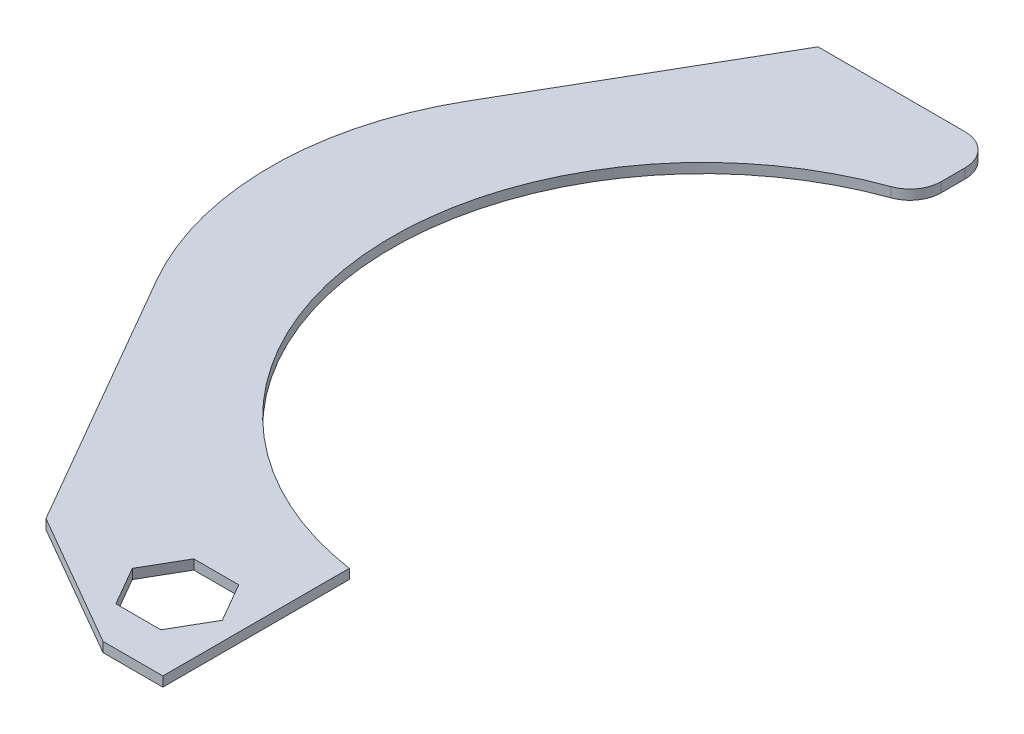
ISO-10303-21;
HEADER;
FILE_DESCRIPTION(('STEP AP214'),'2;1');
FILE_NAME('part.step','',(''),(''),'','','');
FILE_SCHEMA(('AUTOMOTIVE_DESIGN { 1 0 10303 214 1 1 1 1 }'));
ENDSEC;
DATA;
#1=APPLICATION_CONTEXT('core data for automotive mechanical design processes');
#2=APPLICATION_PROTOCOL_DEFINITION('international standard','automotive_design',2000,#1);
#3=PRODUCT_CONTEXT('',#1,'mechanical');
#4=PRODUCT('Part','Part','',(#3));
#5=PRODUCT_RELATED_PRODUCT_CATEGORY('part','',(#4));
#6=PRODUCT_DEFINITION_FORMATION('','',#4);
#7=PRODUCT_DEFINITION_CONTEXT('part definition',#1,'design');
#8=PRODUCT_DEFINITION('design','',#6,#7);
#9=PRODUCT_DEFINITION_SHAPE('','',#8);
#10=(LENGTH_UNIT() NAMED_UNIT(*) SI_UNIT(.MILLI.,.METRE.));
#11=(NAMED_UNIT(*) PLANE_ANGLE_UNIT() SI_UNIT($,.RADIAN.));
#12=(NAMED_UNIT(*) SI_UNIT($,.STERADIAN.) SOLID_ANGLE_UNIT());
#13=UNCERTAINTY_MEASURE_WITH_UNIT(LENGTH_MEASURE(1.E-05),#10,'distance_accuracy_value','');
#14=(GEOMETRIC_REPRESENTATION_CONTEXT(3) GLOBAL_UNCERTAINTY_ASSIGNED_CONTEXT((#13)) GLOBAL_UNIT_ASSIGNED_CONTEXT((#10,
#11,#12)) REPRESENTATION_CONTEXT('',''));
#15=CARTESIAN_POINT('',(0.,0.,0.));
#16=DIRECTION('',(0.,0.,1.));
#17=DIRECTION('',(1.,0.,0.));
#18=AXIS2_PLACEMENT_3D('',#15,#16,#17);
#19=CARTESIAN_POINT('',(-42.8876578754742,1.5875,-61.5836024579529));
#20=DIRECTION('',(0.866025403784439,0.,0.5));
#21=DIRECTION('',(0.5,0.,-0.866025403784439));
#22=AXIS2_PLACEMENT_3D('',#19,#20,#21);
#23=PLANE('',#22);
#24=DIRECTION('',(-0.5,0.,0.866025403784439));
#25=VECTOR('',#24,1.);
#26=CARTESIAN_POINT('',(-42.8876578754742,0.,-61.5836024579529));
#27=LINE('',#26,#25);
#28=CARTESIAN_POINT('',(-42.8876578754742,0.,-61.5836024579529));
#29=VERTEX_POINT('',#28);
#30=CARTESIAN_POINT('',(-63.7782704948237,0.,-25.4));
#31=VERTEX_POINT('',#30);
#32=EDGE_CURVE('E212',#29,#31,#27,.T.);
#33=ORIENTED_EDGE('',*,*,#32,.T.);
#34=DIRECTION('',(0.,-1.,0.));
#35=VECTOR('',#34,1.);
#36=CARTESIAN_POINT('',(-63.7782704948237,1.5875,-25.4));
#37=LINE('',#36,#35);
#38=CARTESIAN_POINT('',(-63.7782704948237,1.5875,-25.4));
#39=VERTEX_POINT('',#38);
#40=EDGE_CURVE('E50',#31,#39,#37,.F.);
#41=ORIENTED_EDGE('',*,*,#40,.T.);
#42=DIRECTION('',(-0.5,0.,0.866025403784439));
#43=VECTOR('',#42,1.);
#44=CARTESIAN_POINT('',(-42.8876578754742,1.5875,-61.5836024579529));
#45=LINE('',#44,#43);
#46=CARTESIAN_POINT('',(-42.8876578754742,1.5875,-61.5836024579529));
#47=VERTEX_POINT('',#46);
#48=EDGE_CURVE('E220',#47,#39,#45,.T.);
#49=ORIENTED_EDGE('',*,*,#48,.F.);
#50=DIRECTION('',(0.,-1.,0.));
#51=VECTOR('',#50,1.);
#52=CARTESIAN_POINT('',(-42.8876578754742,1.5875,-61.5836024579529));
#53=LINE('',#52,#51);
#54=EDGE_CURVE('E237',#47,#29,#53,.T.);
#55=ORIENTED_EDGE('',*,*,#54,.T.);
#56=EDGE_LOOP('',(#33,#41,#49,#55));
#57=FACE_BOUND('',#56,.T.);
#58=ADVANCED_FACE('F42',(#57),#23,.F.);
#59=CARTESIAN_POINT('',(-78.4429673322402,1.5875,0.));
#60=DIRECTION('',(0.866025403784439,0.,-0.5));
#61=DIRECTION('',(-0.5,0.,-0.866025403784439));
#62=AXIS2_PLACEMENT_3D('',#59,#60,#61);
#63=PLANE('',#62);
#64=DIRECTION('',(0.5,0.,0.866025403784439));
#65=VECTOR('',#64,1.);
#66=CARTESIAN_POINT('',(-78.4429673322402,1.5875,0.));
#67=LINE('',#66,#65);
#68=CARTESIAN_POINT('',(-63.7782704948237,1.5875,25.4));
#69=VERTEX_POINT('',#68);
#70=CARTESIAN_POINT('',(-39.2214836661201,1.5875,67.9336024579529));
#71=VERTEX_POINT('',#70);
#72=EDGE_CURVE('E222',#69,#71,#67,.T.);
#73=ORIENTED_EDGE('',*,*,#72,.F.);
#74=DIRECTION('',(0.,-1.,0.));
#75=VECTOR('',#74,1.);
#76=CARTESIAN_POINT('',(-63.7782704948237,1.5875,25.4));
#77=LINE('',#76,#75);
#78=CARTESIAN_POINT('',(-63.7782704948237,0.,25.4));
#79=VERTEX_POINT('',#78);
#80=EDGE_CURVE('E289',#69,#79,#77,.T.);
#81=ORIENTED_EDGE('',*,*,#80,.T.);
#82=DIRECTION('',(0.5,0.,0.866025403784439));
#83=VECTOR('',#82,1.);
#84=CARTESIAN_POINT('',(-78.4429673322402,0.,0.));
#85=LINE('',#84,#83);
#86=CARTESIAN_POINT('',(-39.2214836661201,0.,67.9336024579529));
#87=VERTEX_POINT('',#86);
#88=EDGE_CURVE('E239',#79,#87,#85,.T.);
#89=ORIENTED_EDGE('',*,*,#88,.T.);
#90=DIRECTION('',(0.,-1.,0.));
#91=VECTOR('',#90,1.);
#92=CARTESIAN_POINT('',(-39.2214836661201,1.5875,67.9336024579529));
#93=LINE('',#92,#91);
#94=EDGE_CURVE('E260',#71,#87,#93,.T.);
#95=ORIENTED_EDGE('',*,*,#94,.F.);
#96=EDGE_LOOP('',(#73,#81,#89,#95));
#97=FACE_BOUND('',#96,.T.);
#98=ADVANCED_FACE('F295',(#97),#63,.F.);
#99=CARTESIAN_POINT('',(-39.2214836661201,1.5875,80.6336024579529));
#100=DIRECTION('',(0.,0.,-1.));
#101=DIRECTION('',(-1.,0.,0.));
#102=AXIS2_PLACEMENT_3D('',#99,#100,#101);
#103=PLANE('',#102);
#104=DIRECTION('',(1.,0.,0.));
#105=VECTOR('',#104,1.);
#106=CARTESIAN_POINT('',(-39.2214836661201,1.5875,80.6336024579529));
#107=LINE('',#106,#105);
#108=CARTESIAN_POINT('',(-17.2244384099952,1.5875,80.6336024579529));
#109=VERTEX_POINT('',#108);
#110=CARTESIAN_POINT('',(-7.47148366612005,1.5875,80.6336024579528));
#111=VERTEX_POINT('',#110);
#112=EDGE_CURVE('E225',#109,#111,#107,.T.);
#113=ORIENTED_EDGE('',*,*,#112,.F.);
#114=DIRECTION('',(0.,-1.,0.));
#115=VECTOR('',#114,1.);
#116=CARTESIAN_POINT('',(-17.2244384099952,1.5875,80.6336024579529));
#117=LINE('',#116,#115);
#118=CARTESIAN_POINT('',(-17.2244384099952,0.,80.6336024579529));
#119=VERTEX_POINT('',#118);
#120=EDGE_CURVE('E281',#109,#119,#117,.T.);
#121=ORIENTED_EDGE('',*,*,#120,.T.);
#122=DIRECTION('',(1.,0.,0.));
#123=VECTOR('',#122,1.);
#124=CARTESIAN_POINT('',(-39.2214836661201,0.,80.6336024579529));
#125=LINE('',#124,#123);
#126=CARTESIAN_POINT('',(-7.47148366612005,0.,80.6336024579528));
#127=VERTEX_POINT('',#126);
#128=EDGE_CURVE('E241',#119,#127,#125,.T.);
#129=ORIENTED_EDGE('',*,*,#128,.T.);
#130=DIRECTION('',(0.,-1.,0.));
#131=VECTOR('',#130,1.);
#132=CARTESIAN_POINT('',(-7.47148366612005,1.5875,80.6336024579528));
#133=LINE('',#132,#131);
#134=EDGE_CURVE('E257',#111,#127,#133,.T.);
#135=ORIENTED_EDGE('',*,*,#134,.F.);
#136=EDGE_LOOP('',(#113,#121,#129,#135));
#137=FACE_BOUND('',#136,.T.);
#138=ADVANCED_FACE('F310',(#137),#103,.F.);
#139=CARTESIAN_POINT('',(-7.47148366612005,1.5875,50.24755647618));
#140=DIRECTION('',(-1.,0.,0.));
#141=DIRECTION('',(0.,0.,1.));
#142=AXIS2_PLACEMENT_3D('',#139,#140,#141);
#143=PLANE('',#142);
#144=DIRECTION('',(0.,0.,-1.));
#145=VECTOR('',#144,1.);
#146=CARTESIAN_POINT('',(-7.47148366612005,0.,50.24755647618));
#147=LINE('',#146,#145);
#148=CARTESIAN_POINT('',(-7.47148366612005,0.,50.24755647618));
#149=VERTEX_POINT('',#148);
#150=EDGE_CURVE('E243',#127,#149,#147,.T.);
#151=ORIENTED_EDGE('',*,*,#150,.T.);
#152=DIRECTION('',(0.,-1.,0.));
#153=VECTOR('',#152,1.);
#154=CARTESIAN_POINT('',(-7.47148366612005,1.5875,50.24755647618));
#155=LINE('',#154,#153);
#156=CARTESIAN_POINT('',(-7.47148366612005,1.5875,50.24755647618));
#157=VERTEX_POINT('',#156);
#158=EDGE_CURVE('E254',#157,#149,#155,.T.);
#159=ORIENTED_EDGE('',*,*,#158,.F.);
#160=DIRECTION('',(0.,0.,-1.));
#161=VECTOR('',#160,1.);
#162=CARTESIAN_POINT('',(-7.47148366612005,1.5875,67.9336024579528));
#163=LINE('',#162,#161);
#164=EDGE_CURVE('E227',#111,#157,#163,.T.);
#165=ORIENTED_EDGE('',*,*,#164,.F.);
#166=ORIENTED_EDGE('',*,*,#134,.T.);
#167=EDGE_LOOP('',(#151,#159,#165,#166));
#168=FACE_BOUND('',#167,.T.);
#169=ADVANCED_FACE('F314',(#168),#143,.F.);
#170=CARTESIAN_POINT('',(0.,1.5875,0.));
#171=DIRECTION('',(0.,-1.,0.));
#172=DIRECTION('',(0.,0.,-1.));
#173=AXIS2_PLACEMENT_3D('',#170,#171,#172);
#174=CYLINDRICAL_SURFACE('',#173,50.8);
#175=CARTESIAN_POINT('',(0.,0.,0.));
#176=DIRECTION('',(0.,-1.,0.));
#177=DIRECTION('',(0.,0.,1.));
#178=AXIS2_PLACEMENT_3D('',#175,#176,#177);
#179=CIRCLE('',#178,50.8);
#180=CARTESIAN_POINT('',(-17.1831669692001,0.,-47.8056353676906));
#181=VERTEX_POINT('',#180);
#182=EDGE_CURVE('E245',#149,#181,#179,.T.);
#183=ORIENTED_EDGE('',*,*,#182,.T.);
#184=DIRECTION('',(0.,-1.,0.));
#185=VECTOR('',#184,1.);
#186=CARTESIAN_POINT('',(-17.1831669692001,1.5875,-47.8056353676906));
#187=LINE('',#186,#185);
#188=CARTESIAN_POINT('',(-17.1831669692001,1.5875,-47.8056353676906));
#189=VERTEX_POINT('',#188);
#190=EDGE_CURVE('E272',#181,#189,#187,.F.);
#191=ORIENTED_EDGE('',*,*,#190,.T.);
#192=CARTESIAN_POINT('',(0.,1.5875,0.));
#193=DIRECTION('',(0.,-1.,0.));
#194=DIRECTION('',(0.,0.,1.));
#195=AXIS2_PLACEMENT_3D('',#192,#193,#194);
#196=CIRCLE('',#195,50.8);
#197=EDGE_CURVE('E229',#157,#189,#196,.T.);
#198=ORIENTED_EDGE('',*,*,#197,.F.);
#199=ORIENTED_EDGE('',*,*,#158,.T.);
#200=EDGE_LOOP('',(#183,#191,#198,#199));
#201=FACE_BOUND('',#200,.T.);
#202=ADVANCED_FACE('F384',(#201),#174,.F.);
#203=CARTESIAN_POINT('',(-13.8214836661201,1.5875,-61.5836024579529));
#204=DIRECTION('',(-1.,0.,0.));
#205=DIRECTION('',(0.,0.,1.));
#206=AXIS2_PLACEMENT_3D('',#203,#204,#205);
#207=PLANE('',#206);
#208=DIRECTION('',(0.,0.,-1.));
#209=VECTOR('',#208,1.);
#210=CARTESIAN_POINT('',(-13.8214836661201,1.5875,-61.5836024579529));
#211=LINE('',#210,#209);
#212=CARTESIAN_POINT('',(-13.8214836661201,1.5875,-52.5861989044597));
#213=VERTEX_POINT('',#212);
#214=CARTESIAN_POINT('',(-13.8214836661201,1.5875,-56.5036024579529));
#215=VERTEX_POINT('',#214);
#216=EDGE_CURVE('E232',#213,#215,#211,.T.);
#217=ORIENTED_EDGE('',*,*,#216,.F.);
#218=DIRECTION('',(0.,-1.,0.));
#219=VECTOR('',#218,1.);
#220=CARTESIAN_POINT('',(-13.8214836661201,1.5875,-52.5861989044597));
#221=LINE('',#220,#219);
#222=CARTESIAN_POINT('',(-13.8214836661201,0.,-52.5861989044597));
#223=VERTEX_POINT('',#222);
#224=EDGE_CURVE('E265',#213,#223,#221,.T.);
#225=ORIENTED_EDGE('',*,*,#224,.T.);
#226=DIRECTION('',(0.,0.,-1.));
#227=VECTOR('',#226,1.);
#228=CARTESIAN_POINT('',(-13.8214836661201,0.,-61.5836024579529));
#229=LINE('',#228,#227);
#230=CARTESIAN_POINT('',(-13.8214836661201,0.,-56.5036024579529));
#231=VERTEX_POINT('',#230);
#232=EDGE_CURVE('E248',#223,#231,#229,.T.);
#233=ORIENTED_EDGE('',*,*,#232,.T.);
#234=DIRECTION('',(0.,-1.,0.));
#235=VECTOR('',#234,1.);
#236=CARTESIAN_POINT('',(-13.8214836661201,1.5875,-56.5036024579529));
#237=LINE('',#236,#235);
#238=EDGE_CURVE('E263',#231,#215,#237,.F.);
#239=ORIENTED_EDGE('',*,*,#238,.T.);
#240=EDGE_LOOP('',(#217,#225,#233,#239));
#241=FACE_BOUND('',#240,.T.);
#242=ADVANCED_FACE('F325',(#241),#207,.F.);
#243=CARTESIAN_POINT('',(-13.8214836661201,1.5875,-61.5836024579529));
#244=DIRECTION('',(0.,0.,1.));
#245=DIRECTION('',(1.,0.,0.));
#246=AXIS2_PLACEMENT_3D('',#243,#244,#245);
#247=PLANE('',#246);
#248=DIRECTION('',(-1.,0.,0.));
#249=VECTOR('',#248,1.);
#250=CARTESIAN_POINT('',(-13.8214836661201,1.5875,-61.5836024579529));
#251=LINE('',#250,#249);
#252=CARTESIAN_POINT('',(-18.9014836661201,1.5875,-61.5836024579529));
#253=VERTEX_POINT('',#252);
#254=EDGE_CURVE('E235',#253,#47,#251,.T.);
#255=ORIENTED_EDGE('',*,*,#254,.F.);
#256=DIRECTION('',(0.,-1.,0.));
#257=VECTOR('',#256,1.);
#258=CARTESIAN_POINT('',(-18.9014836661201,1.5875,-61.5836024579529));
#259=LINE('',#258,#257);
#260=CARTESIAN_POINT('',(-18.9014836661201,0.,-61.5836024579529));
#261=VERTEX_POINT('',#260);
#262=EDGE_CURVE('E278',#253,#261,#259,.T.);
#263=ORIENTED_EDGE('',*,*,#262,.T.);
#264=DIRECTION('',(-1.,0.,0.));
#265=VECTOR('',#264,1.);
#266=CARTESIAN_POINT('',(-13.8214836661201,0.,-61.5836024579529));
#267=LINE('',#266,#265);
#268=EDGE_CURVE('E223',#261,#29,#267,.T.);
#269=ORIENTED_EDGE('',*,*,#268,.T.);
#270=ORIENTED_EDGE('',*,*,#54,.F.);
#271=EDGE_LOOP('',(#255,#263,#269,#270));
#272=FACE_BOUND('',#271,.T.);
#273=ADVANCED_FACE('F335',(#272),#247,.F.);
#274=CARTESIAN_POINT('',(0.,1.5875,0.));
#275=DIRECTION('',(0.,1.,0.));
#276=DIRECTION('',(0.,0.,1.));
#277=AXIS2_PLACEMENT_3D('',#274,#275,#276);
#278=PLANE('',#277);
#279=DIRECTION('',(0.5,0.,-0.866025403784439));
#280=VECTOR('',#279,1.);
#281=CARTESIAN_POINT('',(-14.1519257906459,1.5875,74.2836024579529));
#282=LINE('',#281,#280);
#283=CARTESIAN_POINT('',(-14.1519257906459,1.5875,74.2836024579529));
#284=VERTEX_POINT('',#283);
#285=CARTESIAN_POINT('',(-10.4857515812917,1.5875,67.9336024579529));
#286=VERTEX_POINT('',#285);
#287=EDGE_CURVE('E168',#284,#286,#282,.T.);
#288=ORIENTED_EDGE('',*,*,#287,.F.);
#289=DIRECTION('',(1.,0.,0.));
#290=VECTOR('',#289,1.);
#291=CARTESIAN_POINT('',(-21.4842742093541,1.5875,74.2836024579529));
#292=LINE('',#291,#290);
#293=CARTESIAN_POINT('',(-21.4842742093541,1.5875,74.2836024579529));
#294=VERTEX_POINT('',#293);
#295=EDGE_CURVE('E186',#294,#284,#292,.T.);
#296=ORIENTED_EDGE('',*,*,#295,.F.);
#297=DIRECTION('',(0.499999999999999,0.,0.866025403784439));
#298=VECTOR('',#297,1.);
#299=CARTESIAN_POINT('',(-25.1504484187082,1.5875,67.9336024579529));
#300=LINE('',#299,#298);
#301=CARTESIAN_POINT('',(-25.1504484187082,1.5875,67.9336024579529));
#302=VERTEX_POINT('',#301);
#303=EDGE_CURVE('E189',#302,#294,#300,.T.);
#304=ORIENTED_EDGE('',*,*,#303,.F.);
#305=DIRECTION('',(-0.5,0.,0.866025403784439));
#306=VECTOR('',#305,1.);
#307=CARTESIAN_POINT('',(-21.4842742093541,1.5875,61.5836024579529));
#308=LINE('',#307,#306);
#309=CARTESIAN_POINT('',(-21.4842742093541,1.5875,61.5836024579529));
#310=VERTEX_POINT('',#309);
#311=EDGE_CURVE('E205',#310,#302,#308,.T.);
#312=ORIENTED_EDGE('',*,*,#311,.F.);
#313=DIRECTION('',(-1.,0.,0.));
#314=VECTOR('',#313,1.);
#315=CARTESIAN_POINT('',(-14.1519257906459,1.5875,61.5836024579529));
#316=LINE('',#315,#314);
#317=CARTESIAN_POINT('',(-14.1519257906459,1.5875,61.5836024579529));
#318=VERTEX_POINT('',#317);
#319=EDGE_CURVE('E202',#318,#310,#316,.T.);
#320=ORIENTED_EDGE('',*,*,#319,.F.);
#321=DIRECTION('',(-0.500000000000001,0.,-0.866025403784438));
#322=VECTOR('',#321,1.);
#323=CARTESIAN_POINT('',(-10.4857515812917,1.5875,67.9336024579529));
#324=LINE('',#323,#322);
#325=EDGE_CURVE('E200',#286,#318,#324,.T.);
#326=ORIENTED_EDGE('',*,*,#325,.F.);
#327=EDGE_LOOP('',(#288,#296,#304,#312,#320,#326));
#328=FACE_BOUND('',#327,.T.);
#329=ORIENTED_EDGE('',*,*,#48,.T.);
#330=CARTESIAN_POINT('',(-19.7841799825742,1.5875,0.));
#331=DIRECTION('',(0.,1.,0.));
#332=DIRECTION('',(0.,0.,1.));
#333=AXIS2_PLACEMENT_3D('',#330,#331,#332);
#334=CIRCLE('',#333,50.8);
#335=EDGE_CURVE('E11',#39,#69,#334,.T.);
#336=ORIENTED_EDGE('',*,*,#335,.T.);
#337=ORIENTED_EDGE('',*,*,#72,.T.);
#338=DIRECTION('',(-0.866025403784441,0.,-0.499999999999996));
#339=VECTOR('',#338,1.);
#340=CARTESIAN_POINT('',(-39.2214836661198,1.5875,67.9336024579531));
#341=LINE('',#340,#339);
#342=EDGE_CURVE('E287',#71,#109,#341,.F.);
#343=ORIENTED_EDGE('',*,*,#342,.T.);
#344=ORIENTED_EDGE('',*,*,#112,.T.);
#345=ORIENTED_EDGE('',*,*,#164,.T.);
#346=ORIENTED_EDGE('',*,*,#197,.T.);
#347=CARTESIAN_POINT('',(-18.9014836661201,1.5875,-52.5861989044597));
#348=DIRECTION('',(0.,1.,0.));
#349=DIRECTION('',(0.,0.,1.));
#350=AXIS2_PLACEMENT_3D('',#347,#348,#349);
#351=CIRCLE('',#350,5.08);
#352=EDGE_CURVE('E276',#189,#213,#351,.T.);
#353=ORIENTED_EDGE('',*,*,#352,.T.);
#354=ORIENTED_EDGE('',*,*,#216,.T.);
#355=CARTESIAN_POINT('',(-18.9014836661201,1.5875,-56.5036024579529));
#356=DIRECTION('',(0.,1.,0.));
#357=DIRECTION('',(0.,0.,1.));
#358=AXIS2_PLACEMENT_3D('',#355,#356,#357);
#359=CIRCLE('',#358,5.08);
#360=EDGE_CURVE('E274',#215,#253,#359,.T.);
#361=ORIENTED_EDGE('',*,*,#360,.T.);
#362=ORIENTED_EDGE('',*,*,#254,.T.);
#363=EDGE_LOOP('',(#329,#336,#337,#343,#344,#345,#346,#353,#354,#361,#362));
#364=FACE_BOUND('',#363,.T.);
#365=ADVANCED_FACE('F307',(#328,#364),#278,.T.);
#366=CARTESIAN_POINT('',(0.,0.,0.));
#367=DIRECTION('',(0.,1.,0.));
#368=DIRECTION('',(0.,0.,1.));
#369=AXIS2_PLACEMENT_3D('',#366,#367,#368);
#370=PLANE('',#369);
#371=DIRECTION('',(1.,0.,0.));
#372=VECTOR('',#371,1.);
#373=CARTESIAN_POINT('',(-21.4842742093541,0.,74.2836024579529));
#374=LINE('',#373,#372);
#375=CARTESIAN_POINT('',(-21.4842742093541,0.,74.2836024579529));
#376=VERTEX_POINT('',#375);
#377=CARTESIAN_POINT('',(-14.1519257906459,0.,74.2836024579529));
#378=VERTEX_POINT('',#377);
#379=EDGE_CURVE('E173',#376,#378,#374,.T.);
#380=ORIENTED_EDGE('',*,*,#379,.T.);
#381=DIRECTION('',(0.5,0.,-0.866025403784439));
#382=VECTOR('',#381,1.);
#383=CARTESIAN_POINT('',(-14.1519257906459,0.,74.2836024579529));
#384=LINE('',#383,#382);
#385=CARTESIAN_POINT('',(-10.4857515812917,0.,67.9336024579529));
#386=VERTEX_POINT('',#385);
#387=EDGE_CURVE('E165',#378,#386,#384,.T.);
#388=ORIENTED_EDGE('',*,*,#387,.T.);
#389=DIRECTION('',(-0.500000000000001,0.,-0.866025403784438));
#390=VECTOR('',#389,1.);
#391=CARTESIAN_POINT('',(-10.4857515812917,0.,67.9336024579529));
#392=LINE('',#391,#390);
#393=CARTESIAN_POINT('',(-14.1519257906459,0.,61.5836024579529));
#394=VERTEX_POINT('',#393);
#395=EDGE_CURVE('E177',#386,#394,#392,.T.);
#396=ORIENTED_EDGE('',*,*,#395,.T.);
#397=DIRECTION('',(-1.,0.,0.));
#398=VECTOR('',#397,1.);
#399=CARTESIAN_POINT('',(-14.1519257906459,0.,61.5836024579529));
#400=LINE('',#399,#398);
#401=CARTESIAN_POINT('',(-21.4842742093541,0.,61.5836024579529));
#402=VERTEX_POINT('',#401);
#403=EDGE_CURVE('E181',#394,#402,#400,.T.);
#404=ORIENTED_EDGE('',*,*,#403,.T.);
#405=DIRECTION('',(-0.5,0.,0.866025403784439));
#406=VECTOR('',#405,1.);
#407=CARTESIAN_POINT('',(-21.4842742093541,0.,61.5836024579529));
#408=LINE('',#407,#406);
#409=CARTESIAN_POINT('',(-25.1504484187082,0.,67.9336024579529));
#410=VERTEX_POINT('',#409);
#411=EDGE_CURVE('E193',#402,#410,#408,.T.);
#412=ORIENTED_EDGE('',*,*,#411,.T.);
#413=DIRECTION('',(0.499999999999999,0.,0.866025403784439));
#414=VECTOR('',#413,1.);
#415=CARTESIAN_POINT('',(-25.1504484187082,0.,67.9336024579529));
#416=LINE('',#415,#414);
#417=EDGE_CURVE('E196',#410,#376,#416,.T.);
#418=ORIENTED_EDGE('',*,*,#417,.T.);
#419=EDGE_LOOP('',(#380,#388,#396,#404,#412,#418));
#420=FACE_BOUND('',#419,.T.);
#421=ORIENTED_EDGE('',*,*,#88,.F.);
#422=CARTESIAN_POINT('',(-19.7841799825742,0.,0.));
#423=DIRECTION('',(0.,1.,0.));
#424=DIRECTION('',(0.,0.,1.));
#425=AXIS2_PLACEMENT_3D('',#422,#423,#424);
#426=CIRCLE('',#425,50.8);
#427=EDGE_CURVE('E64',#79,#31,#426,.F.);
#428=ORIENTED_EDGE('',*,*,#427,.T.);
#429=ORIENTED_EDGE('',*,*,#32,.F.);
#430=ORIENTED_EDGE('',*,*,#268,.F.);
#431=CARTESIAN_POINT('',(-18.9014836661201,0.,-56.5036024579529));
#432=DIRECTION('',(0.,1.,0.));
#433=DIRECTION('',(0.,0.,1.));
#434=AXIS2_PLACEMENT_3D('',#431,#432,#433);
#435=CIRCLE('',#434,5.08);
#436=EDGE_CURVE('E268',#261,#231,#435,.F.);
#437=ORIENTED_EDGE('',*,*,#436,.T.);
#438=ORIENTED_EDGE('',*,*,#232,.F.);
#439=CARTESIAN_POINT('',(-18.9014836661201,0.,-52.5861989044597));
#440=DIRECTION('',(0.,1.,0.));
#441=DIRECTION('',(0.,0.,1.));
#442=AXIS2_PLACEMENT_3D('',#439,#440,#441);
#443=CIRCLE('',#442,5.08);
#444=EDGE_CURVE('E270',#223,#181,#443,.F.);
#445=ORIENTED_EDGE('',*,*,#444,.T.);
#446=ORIENTED_EDGE('',*,*,#182,.F.);
#447=ORIENTED_EDGE('',*,*,#150,.F.);
#448=ORIENTED_EDGE('',*,*,#128,.F.);
#449=DIRECTION('',(0.866025403784441,0.,0.499999999999996));
#450=VECTOR('',#449,1.);
#451=CARTESIAN_POINT('',(-17.2244384099952,0.,80.6336024579529));
#452=LINE('',#451,#450);
#453=EDGE_CURVE('E284',#119,#87,#452,.F.);
#454=ORIENTED_EDGE('',*,*,#453,.T.);
#455=EDGE_LOOP('',(#421,#428,#429,#430,#437,#438,#445,#446,#447,#448,#454));
#456=FACE_BOUND('',#455,.T.);
#457=ADVANCED_FACE('F183',(#420,#456),#370,.F.);
#458=CARTESIAN_POINT('',(-14.1519257906459,0.,74.2836024579529));
#459=DIRECTION('',(0.866025403784439,0.,0.5));
#460=DIRECTION('',(0.5,0.,-0.866025403784439));
#461=AXIS2_PLACEMENT_3D('',#458,#459,#460);
#462=PLANE('',#461);
#463=ORIENTED_EDGE('',*,*,#287,.T.);
#464=DIRECTION('',(0.,1.,0.));
#465=VECTOR('',#464,1.);
#466=CARTESIAN_POINT('',(-10.4857515812917,0.,67.9336024579529));
#467=LINE('',#466,#465);
#468=EDGE_CURVE('E161',#386,#286,#467,.T.);
#469=ORIENTED_EDGE('',*,*,#468,.F.);
#470=ORIENTED_EDGE('',*,*,#387,.F.);
#471=DIRECTION('',(0.,1.,0.));
#472=VECTOR('',#471,1.);
#473=CARTESIAN_POINT('',(-14.1519257906459,0.,74.2836024579529));
#474=LINE('',#473,#472);
#475=EDGE_CURVE('E210',#378,#284,#474,.T.);
#476=ORIENTED_EDGE('',*,*,#475,.T.);
#477=EDGE_LOOP('',(#463,#469,#470,#476));
#478=FACE_BOUND('',#477,.T.);
#479=ADVANCED_FACE('F163',(#478),#462,.F.);
#480=CARTESIAN_POINT('',(-21.4842742093541,0.,74.2836024579529));
#481=DIRECTION('',(0.,0.,1.));
#482=DIRECTION('',(1.,0.,0.));
#483=AXIS2_PLACEMENT_3D('',#480,#481,#482);
#484=PLANE('',#483);
#485=ORIENTED_EDGE('',*,*,#295,.T.);
#486=ORIENTED_EDGE('',*,*,#475,.F.);
#487=ORIENTED_EDGE('',*,*,#379,.F.);
#488=DIRECTION('',(0.,1.,0.));
#489=VECTOR('',#488,1.);
#490=CARTESIAN_POINT('',(-21.4842742093541,0.,74.2836024579529));
#491=LINE('',#490,#489);
#492=EDGE_CURVE('E213',#376,#294,#491,.T.);
#493=ORIENTED_EDGE('',*,*,#492,.T.);
#494=EDGE_LOOP('',(#485,#486,#487,#493));
#495=FACE_BOUND('',#494,.T.);
#496=ADVANCED_FACE('F434',(#495),#484,.F.);
#497=CARTESIAN_POINT('',(-25.1504484187082,0.,67.9336024579529));
#498=DIRECTION('',(-0.866025403784439,0.,0.499999999999999));
#499=DIRECTION('',(0.499999999999999,0.,0.866025403784439));
#500=AXIS2_PLACEMENT_3D('',#497,#498,#499);
#501=PLANE('',#500);
#502=ORIENTED_EDGE('',*,*,#303,.T.);
#503=ORIENTED_EDGE('',*,*,#492,.F.);
#504=ORIENTED_EDGE('',*,*,#417,.F.);
#505=DIRECTION('',(0.,1.,0.));
#506=VECTOR('',#505,1.);
#507=CARTESIAN_POINT('',(-25.1504484187082,0.,67.9336024579529));
#508=LINE('',#507,#506);
#509=EDGE_CURVE('E215',#410,#302,#508,.T.);
#510=ORIENTED_EDGE('',*,*,#509,.T.);
#511=EDGE_LOOP('',(#502,#503,#504,#510));
#512=FACE_BOUND('',#511,.T.);
#513=ADVANCED_FACE('F440',(#512),#501,.F.);
#514=CARTESIAN_POINT('',(-21.4842742093541,0.,61.5836024579529));
#515=DIRECTION('',(-0.866025403784438,0.,-0.5));
#516=DIRECTION('',(-0.5,0.,0.866025403784439));
#517=AXIS2_PLACEMENT_3D('',#514,#515,#516);
#518=PLANE('',#517);
#519=ORIENTED_EDGE('',*,*,#311,.T.);
#520=ORIENTED_EDGE('',*,*,#509,.F.);
#521=ORIENTED_EDGE('',*,*,#411,.F.);
#522=DIRECTION('',(0.,1.,0.));
#523=VECTOR('',#522,1.);
#524=CARTESIAN_POINT('',(-21.4842742093541,0.,61.5836024579529));
#525=LINE('',#524,#523);
#526=EDGE_CURVE('E217',#402,#310,#525,.T.);
#527=ORIENTED_EDGE('',*,*,#526,.T.);
#528=EDGE_LOOP('',(#519,#520,#521,#527));
#529=FACE_BOUND('',#528,.T.);
#530=ADVANCED_FACE('F448',(#529),#518,.F.);
#531=CARTESIAN_POINT('',(-14.1519257906459,0.,61.5836024579529));
#532=DIRECTION('',(0.,0.,-1.));
#533=DIRECTION('',(-1.,0.,0.));
#534=AXIS2_PLACEMENT_3D('',#531,#532,#533);
#535=PLANE('',#534);
#536=ORIENTED_EDGE('',*,*,#319,.T.);
#537=ORIENTED_EDGE('',*,*,#526,.F.);
#538=ORIENTED_EDGE('',*,*,#403,.F.);
#539=DIRECTION('',(0.,1.,0.));
#540=VECTOR('',#539,1.);
#541=CARTESIAN_POINT('',(-14.1519257906459,0.,61.5836024579529));
#542=LINE('',#541,#540);
#543=EDGE_CURVE('E172',#394,#318,#542,.T.);
#544=ORIENTED_EDGE('',*,*,#543,.T.);
#545=EDGE_LOOP('',(#536,#537,#538,#544));
#546=FACE_BOUND('',#545,.T.);
#547=ADVANCED_FACE('F456',(#546),#535,.F.);
#548=CARTESIAN_POINT('',(-10.4857515812917,0.,67.9336024579529));
#549=DIRECTION('',(0.866025403784438,0.,-0.5));
#550=DIRECTION('',(-0.500000000000001,0.,-0.866025403784438));
#551=AXIS2_PLACEMENT_3D('',#548,#549,#550);
#552=PLANE('',#551);
#553=ORIENTED_EDGE('',*,*,#325,.T.);
#554=ORIENTED_EDGE('',*,*,#543,.F.);
#555=ORIENTED_EDGE('',*,*,#395,.F.);
#556=ORIENTED_EDGE('',*,*,#468,.T.);
#557=EDGE_LOOP('',(#553,#554,#555,#556));
#558=FACE_BOUND('',#557,.T.);
#559=ADVANCED_FACE('F178',(#558),#552,.F.);
#560=CARTESIAN_POINT('',(-18.9014836661201,1.5875,-52.5861989044597));
#561=DIRECTION('',(0.,-1.,0.));
#562=DIRECTION('',(0.,0.,-1.));
#563=AXIS2_PLACEMENT_3D('',#560,#561,#562);
#564=CYLINDRICAL_SURFACE('',#563,5.08);
#565=ORIENTED_EDGE('',*,*,#352,.F.);
#566=ORIENTED_EDGE('',*,*,#190,.F.);
#567=ORIENTED_EDGE('',*,*,#444,.F.);
#568=ORIENTED_EDGE('',*,*,#224,.F.);
#569=EDGE_LOOP('',(#565,#566,#567,#568));
#570=FACE_BOUND('',#569,.T.);
#571=ADVANCED_FACE('F322',(#570),#564,.T.);
#572=CARTESIAN_POINT('',(-18.9014836661201,1.5875,-56.5036024579529));
#573=DIRECTION('',(0.,-1.,0.));
#574=DIRECTION('',(0.,0.,-1.));
#575=AXIS2_PLACEMENT_3D('',#572,#573,#574);
#576=CYLINDRICAL_SURFACE('',#575,5.08);
#577=ORIENTED_EDGE('',*,*,#360,.F.);
#578=ORIENTED_EDGE('',*,*,#238,.F.);
#579=ORIENTED_EDGE('',*,*,#436,.F.);
#580=ORIENTED_EDGE('',*,*,#262,.F.);
#581=EDGE_LOOP('',(#577,#578,#579,#580));
#582=FACE_BOUND('',#581,.T.);
#583=ADVANCED_FACE('F332',(#582),#576,.T.);
#584=CARTESIAN_POINT('',(-17.2244384099952,1.5875,80.6336024579529));
#585=DIRECTION('',(0.499999999999996,0.,-0.866025403784441));
#586=DIRECTION('',(0.,-1.,0.));
#587=AXIS2_PLACEMENT_3D('',#584,#585,#586);
#588=PLANE('',#587);
#589=ORIENTED_EDGE('',*,*,#342,.F.);
#590=ORIENTED_EDGE('',*,*,#94,.T.);
#591=ORIENTED_EDGE('',*,*,#453,.F.);
#592=ORIENTED_EDGE('',*,*,#120,.F.);
#593=EDGE_LOOP('',(#589,#590,#591,#592));
#594=FACE_BOUND('',#593,.T.);
#595=ADVANCED_FACE('F304',(#594),#588,.F.);
#596=CARTESIAN_POINT('',(-19.7841799825742,1.5875,0.));
#597=DIRECTION('',(0.,-1.,0.));
#598=DIRECTION('',(0.,0.,-1.));
#599=AXIS2_PLACEMENT_3D('',#596,#597,#598);
#600=CYLINDRICAL_SURFACE('',#599,50.8);
#601=ORIENTED_EDGE('',*,*,#335,.F.);
#602=ORIENTED_EDGE('',*,*,#40,.F.);
#603=ORIENTED_EDGE('',*,*,#427,.F.);
#604=ORIENTED_EDGE('',*,*,#80,.F.);
#605=EDGE_LOOP('',(#601,#602,#603,#604));
#606=FACE_BOUND('',#605,.T.);
#607=ADVANCED_FACE('F44',(#606),#600,.T.);
#608=CLOSED_SHELL('',(#58,#98,#138,#169,#202,#242,#273,#365,#457,#479,#496,#513,#530,#547,#559,
#571,#583,#595,#607));
#609=MANIFOLD_SOLID_BREP('B2',#608);
#610=ADVANCED_BREP_SHAPE_REPRESENTATION('',(#18,#609),#14);
#611=SHAPE_DEFINITION_REPRESENTATION(#9,#610);
ENDSEC;
END-ISO-10303-21;
